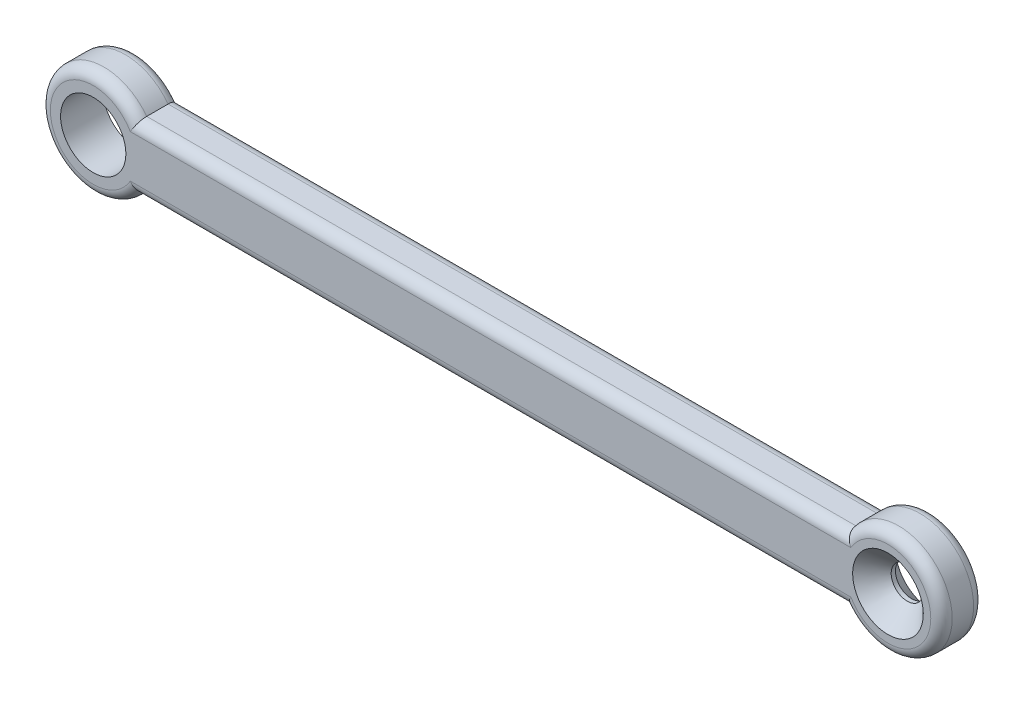
ISO-10303-21;
HEADER;
FILE_DESCRIPTION(('STEP AP214'),'2;1');
FILE_NAME('part.step','',(''),(''),'','','');
FILE_SCHEMA(('AUTOMOTIVE_DESIGN { 1 0 10303 214 1 1 1 1 }'));
ENDSEC;
DATA;
#1=APPLICATION_CONTEXT('core data for automotive mechanical design processes');
#2=APPLICATION_PROTOCOL_DEFINITION('international standard','automotive_design',2000,#1);
#3=PRODUCT_CONTEXT('',#1,'mechanical');
#4=PRODUCT('Part','Part','',(#3));
#5=PRODUCT_RELATED_PRODUCT_CATEGORY('part','',(#4));
#6=PRODUCT_DEFINITION_FORMATION('','',#4);
#7=PRODUCT_DEFINITION_CONTEXT('part definition',#1,'design');
#8=PRODUCT_DEFINITION('design','',#6,#7);
#9=PRODUCT_DEFINITION_SHAPE('','',#8);
#10=(LENGTH_UNIT() NAMED_UNIT(*) SI_UNIT(.MILLI.,.METRE.));
#11=(NAMED_UNIT(*) PLANE_ANGLE_UNIT() SI_UNIT($,.RADIAN.));
#12=(NAMED_UNIT(*) SI_UNIT($,.STERADIAN.) SOLID_ANGLE_UNIT());
#13=UNCERTAINTY_MEASURE_WITH_UNIT(LENGTH_MEASURE(1.E-05),#10,'distance_accuracy_value','');
#14=(GEOMETRIC_REPRESENTATION_CONTEXT(3) GLOBAL_UNCERTAINTY_ASSIGNED_CONTEXT((#13)) GLOBAL_UNIT_ASSIGNED_CONTEXT((#10,
#11,#12)) REPRESENTATION_CONTEXT('',''));
#15=CARTESIAN_POINT('',(0.,0.,0.));
#16=DIRECTION('',(0.,0.,1.));
#17=DIRECTION('',(1.,0.,0.));
#18=AXIS2_PLACEMENT_3D('',#15,#16,#17);
#19=CARTESIAN_POINT('',(-37.125,0.,0.));
#20=DIRECTION('',(0.,0.,-1.));
#21=DIRECTION('',(-1.,0.,0.));
#22=AXIS2_PLACEMENT_3D('',#19,#20,#21);
#23=PLANE('',#22);
#24=DIRECTION('',(1.,0.,0.));
#25=VECTOR('',#24,1.);
#26=CARTESIAN_POINT('',(-37.125,2.,0.));
#27=LINE('',#26,#25);
#28=CARTESIAN_POINT('',(-33.6608983848623,2.,0.));
#29=VERTEX_POINT('',#28);
#30=CARTESIAN_POINT('',(33.6608983848623,2.,0.));
#31=VERTEX_POINT('',#30);
#32=EDGE_CURVE('E46',#29,#31,#27,.T.);
#33=ORIENTED_EDGE('',*,*,#32,.T.);
#34=CARTESIAN_POINT('',(37.125,0.,0.));
#35=DIRECTION('',(0.,0.,-1.));
#36=DIRECTION('',(-1.,0.,0.));
#37=AXIS2_PLACEMENT_3D('',#34,#35,#36);
#38=CIRCLE('',#37,4.);
#39=CARTESIAN_POINT('',(33.6608983848623,-2.,0.));
#40=VERTEX_POINT('',#39);
#41=EDGE_CURVE('E11',#31,#40,#38,.T.);
#42=ORIENTED_EDGE('',*,*,#41,.T.);
#43=DIRECTION('',(-1.,0.,0.));
#44=VECTOR('',#43,1.);
#45=CARTESIAN_POINT('',(-37.125,-2.,0.));
#46=LINE('',#45,#44);
#47=CARTESIAN_POINT('',(-33.6608983848623,-2.,0.));
#48=VERTEX_POINT('',#47);
#49=EDGE_CURVE('E165',#40,#48,#46,.T.);
#50=ORIENTED_EDGE('',*,*,#49,.T.);
#51=CARTESIAN_POINT('',(-37.125,0.,0.));
#52=DIRECTION('',(0.,0.,-1.));
#53=DIRECTION('',(-1.,0.,0.));
#54=AXIS2_PLACEMENT_3D('',#51,#52,#53);
#55=CIRCLE('',#54,4.);
#56=EDGE_CURVE('E163',#48,#29,#55,.T.);
#57=ORIENTED_EDGE('',*,*,#56,.T.);
#58=EDGE_LOOP('',(#33,#42,#50,#57));
#59=FACE_BOUND('',#58,.T.);
#60=CARTESIAN_POINT('',(37.125,0.,0.));
#61=DIRECTION('',(0.,0.,1.));
#62=DIRECTION('',(0.,-1.,0.));
#63=AXIS2_PLACEMENT_3D('',#60,#61,#62);
#64=CIRCLE('',#63,3.3);
#65=CARTESIAN_POINT('',(37.125,-3.3,0.));
#66=VERTEX_POINT('',#65);
#67=EDGE_CURVE('E282',#66,#66,#64,.T.);
#68=ORIENTED_EDGE('',*,*,#67,.T.);
#69=EDGE_LOOP('',(#68));
#70=FACE_BOUND('',#69,.T.);
#71=CARTESIAN_POINT('',(-37.125,0.,0.));
#72=DIRECTION('',(0.,0.,1.));
#73=DIRECTION('',(0.,-1.,0.));
#74=AXIS2_PLACEMENT_3D('',#71,#72,#73);
#75=CIRCLE('',#74,3.04999999999999);
#76=CARTESIAN_POINT('',(-37.125,-3.04999999999999,0.));
#77=VERTEX_POINT('',#76);
#78=EDGE_CURVE('E264',#77,#77,#75,.T.);
#79=ORIENTED_EDGE('',*,*,#78,.T.);
#80=EDGE_LOOP('',(#79));
#81=FACE_BOUND('',#80,.T.);
#82=ADVANCED_FACE('F33',(#59,#70,#81),#23,.T.);
#83=CARTESIAN_POINT('',(-37.125,0.,4.));
#84=DIRECTION('',(0.,0.,-1.));
#85=DIRECTION('',(-1.,0.,0.));
#86=AXIS2_PLACEMENT_3D('',#83,#84,#85);
#87=CYLINDRICAL_SURFACE('',#86,5.);
#88=DIRECTION('',(0.,0.,-1.));
#89=VECTOR('',#88,1.);
#90=CARTESIAN_POINT('',(-33.125,-3.,4.));
#91=LINE('',#90,#89);
#92=CARTESIAN_POINT('',(-33.125,-3.,3.));
#93=VERTEX_POINT('',#92);
#94=CARTESIAN_POINT('',(-33.125,-3.,1.));
#95=VERTEX_POINT('',#94);
#96=EDGE_CURVE('E109',#93,#95,#91,.T.);
#97=ORIENTED_EDGE('',*,*,#96,.F.);
#98=CARTESIAN_POINT('',(-37.125,0.,3.));
#99=DIRECTION('',(0.,0.,-1.));
#100=DIRECTION('',(-1.,0.,0.));
#101=AXIS2_PLACEMENT_3D('',#98,#99,#100);
#102=CIRCLE('',#101,5.);
#103=CARTESIAN_POINT('',(-33.125,3.,3.));
#104=VERTEX_POINT('',#103);
#105=EDGE_CURVE('E125',#93,#104,#102,.T.);
#106=ORIENTED_EDGE('',*,*,#105,.T.);
#107=DIRECTION('',(0.,0.,-1.));
#108=VECTOR('',#107,1.);
#109=CARTESIAN_POINT('',(-33.125,3.,4.));
#110=LINE('',#109,#108);
#111=CARTESIAN_POINT('',(-33.125,3.,1.));
#112=VERTEX_POINT('',#111);
#113=EDGE_CURVE('E259',#104,#112,#110,.T.);
#114=ORIENTED_EDGE('',*,*,#113,.T.);
#115=CARTESIAN_POINT('',(-37.125,0.,1.));
#116=DIRECTION('',(0.,0.,-1.));
#117=DIRECTION('',(-1.,0.,0.));
#118=AXIS2_PLACEMENT_3D('',#115,#116,#117);
#119=CIRCLE('',#118,5.);
#120=EDGE_CURVE('E128',#112,#95,#119,.F.);
#121=ORIENTED_EDGE('',*,*,#120,.T.);
#122=EDGE_LOOP('',(#97,#106,#114,#121));
#123=FACE_BOUND('',#122,.T.);
#124=ADVANCED_FACE('F122',(#123),#87,.T.);
#125=CARTESIAN_POINT('',(-33.125,-3.,4.));
#126=DIRECTION('',(0.,-1.,0.));
#127=DIRECTION('',(0.,0.,-1.));
#128=AXIS2_PLACEMENT_3D('',#125,#126,#127);
#129=PLANE('',#128);
#130=DIRECTION('',(0.,0.,-1.));
#131=VECTOR('',#130,1.);
#132=CARTESIAN_POINT('',(33.125,-3.,4.));
#133=LINE('',#132,#131);
#134=CARTESIAN_POINT('',(33.125,-3.,3.));
#135=VERTEX_POINT('',#134);
#136=CARTESIAN_POINT('',(33.125,-3.,1.));
#137=VERTEX_POINT('',#136);
#138=EDGE_CURVE('E112',#135,#137,#133,.T.);
#139=ORIENTED_EDGE('',*,*,#138,.F.);
#140=DIRECTION('',(-1.,0.,0.));
#141=VECTOR('',#140,1.);
#142=CARTESIAN_POINT('',(-33.125,-3.,3.));
#143=LINE('',#142,#141);
#144=EDGE_CURVE('E106',#135,#93,#143,.T.);
#145=ORIENTED_EDGE('',*,*,#144,.T.);
#146=ORIENTED_EDGE('',*,*,#96,.T.);
#147=DIRECTION('',(-1.,0.,0.));
#148=VECTOR('',#147,1.);
#149=CARTESIAN_POINT('',(-33.125,-3.,1.));
#150=LINE('',#149,#148);
#151=EDGE_CURVE('E118',#95,#137,#150,.F.);
#152=ORIENTED_EDGE('',*,*,#151,.T.);
#153=EDGE_LOOP('',(#139,#145,#146,#152));
#154=FACE_BOUND('',#153,.T.);
#155=ADVANCED_FACE('F108',(#154),#129,.T.);
#156=CARTESIAN_POINT('',(37.125,0.,4.));
#157=DIRECTION('',(0.,0.,-1.));
#158=DIRECTION('',(-1.,0.,0.));
#159=AXIS2_PLACEMENT_3D('',#156,#157,#158);
#160=CYLINDRICAL_SURFACE('',#159,5.);
#161=DIRECTION('',(0.,0.,-1.));
#162=VECTOR('',#161,1.);
#163=CARTESIAN_POINT('',(33.125,3.,4.));
#164=LINE('',#163,#162);
#165=CARTESIAN_POINT('',(33.125,3.,3.));
#166=VERTEX_POINT('',#165);
#167=CARTESIAN_POINT('',(33.125,3.,1.));
#168=VERTEX_POINT('',#167);
#169=EDGE_CURVE('E263',#166,#168,#164,.T.);
#170=ORIENTED_EDGE('',*,*,#169,.F.);
#171=CARTESIAN_POINT('',(37.125,0.,3.));
#172=DIRECTION('',(0.,0.,-1.));
#173=DIRECTION('',(-1.,0.,0.));
#174=AXIS2_PLACEMENT_3D('',#171,#172,#173);
#175=CIRCLE('',#174,5.);
#176=EDGE_CURVE('E161',#166,#135,#175,.T.);
#177=ORIENTED_EDGE('',*,*,#176,.T.);
#178=ORIENTED_EDGE('',*,*,#138,.T.);
#179=CARTESIAN_POINT('',(37.125,0.,1.));
#180=DIRECTION('',(0.,0.,-1.));
#181=DIRECTION('',(-1.,0.,0.));
#182=AXIS2_PLACEMENT_3D('',#179,#180,#181);
#183=CIRCLE('',#182,5.);
#184=EDGE_CURVE('E117',#137,#168,#183,.F.);
#185=ORIENTED_EDGE('',*,*,#184,.T.);
#186=EDGE_LOOP('',(#170,#177,#178,#185));
#187=FACE_BOUND('',#186,.T.);
#188=ADVANCED_FACE('F247',(#187),#160,.T.);
#189=CARTESIAN_POINT('',(-33.125,3.,4.));
#190=DIRECTION('',(0.,1.,0.));
#191=DIRECTION('',(0.,0.,1.));
#192=AXIS2_PLACEMENT_3D('',#189,#190,#191);
#193=PLANE('',#192);
#194=ORIENTED_EDGE('',*,*,#113,.F.);
#195=DIRECTION('',(1.,0.,0.));
#196=VECTOR('',#195,1.);
#197=CARTESIAN_POINT('',(33.125,3.,3.));
#198=LINE('',#197,#196);
#199=EDGE_CURVE('E156',#104,#166,#198,.T.);
#200=ORIENTED_EDGE('',*,*,#199,.T.);
#201=ORIENTED_EDGE('',*,*,#169,.T.);
#202=DIRECTION('',(1.,0.,0.));
#203=VECTOR('',#202,1.);
#204=CARTESIAN_POINT('',(-33.125,3.,1.));
#205=LINE('',#204,#203);
#206=EDGE_CURVE('E154',#168,#112,#205,.F.);
#207=ORIENTED_EDGE('',*,*,#206,.T.);
#208=EDGE_LOOP('',(#194,#200,#201,#207));
#209=FACE_BOUND('',#208,.T.);
#210=ADVANCED_FACE('F250',(#209),#193,.T.);
#211=CARTESIAN_POINT('',(-37.125,0.,4.));
#212=DIRECTION('',(0.,0.,-1.));
#213=DIRECTION('',(-1.,0.,0.));
#214=AXIS2_PLACEMENT_3D('',#211,#212,#213);
#215=PLANE('',#214);
#216=DIRECTION('',(1.,0.,0.));
#217=VECTOR('',#216,1.);
#218=CARTESIAN_POINT('',(-33.125,2.,4.));
#219=LINE('',#218,#217);
#220=CARTESIAN_POINT('',(33.6608983848623,2.,4.));
#221=VERTEX_POINT('',#220);
#222=CARTESIAN_POINT('',(-33.6608983848623,2.,4.));
#223=VERTEX_POINT('',#222);
#224=EDGE_CURVE('E150',#221,#223,#219,.F.);
#225=ORIENTED_EDGE('',*,*,#224,.T.);
#226=CARTESIAN_POINT('',(-37.125,0.,4.));
#227=DIRECTION('',(0.,0.,-1.));
#228=DIRECTION('',(-1.,0.,0.));
#229=AXIS2_PLACEMENT_3D('',#226,#227,#228);
#230=CIRCLE('',#229,4.);
#231=CARTESIAN_POINT('',(-33.6608983848623,-2.,4.));
#232=VERTEX_POINT('',#231);
#233=EDGE_CURVE('E152',#223,#232,#230,.F.);
#234=ORIENTED_EDGE('',*,*,#233,.T.);
#235=DIRECTION('',(-1.,0.,0.));
#236=VECTOR('',#235,1.);
#237=CARTESIAN_POINT('',(33.125,-2.,4.));
#238=LINE('',#237,#236);
#239=CARTESIAN_POINT('',(33.6608983848623,-2.,4.));
#240=VERTEX_POINT('',#239);
#241=EDGE_CURVE('E133',#232,#240,#238,.F.);
#242=ORIENTED_EDGE('',*,*,#241,.T.);
#243=CARTESIAN_POINT('',(37.125,0.,4.));
#244=DIRECTION('',(0.,0.,-1.));
#245=DIRECTION('',(-1.,0.,0.));
#246=AXIS2_PLACEMENT_3D('',#243,#244,#245);
#247=CIRCLE('',#246,4.);
#248=EDGE_CURVE('E143',#240,#221,#247,.F.);
#249=ORIENTED_EDGE('',*,*,#248,.T.);
#250=EDGE_LOOP('',(#225,#234,#242,#249));
#251=FACE_BOUND('',#250,.T.);
#252=CARTESIAN_POINT('',(37.125,0.,4.));
#253=DIRECTION('',(0.,0.,1.));
#254=DIRECTION('',(0.,-1.,0.));
#255=AXIS2_PLACEMENT_3D('',#252,#253,#254);
#256=CIRCLE('',#255,3.3);
#257=CARTESIAN_POINT('',(37.125,-3.3,4.));
#258=VERTEX_POINT('',#257);
#259=EDGE_CURVE('E279',#258,#258,#256,.T.);
#260=ORIENTED_EDGE('',*,*,#259,.F.);
#261=EDGE_LOOP('',(#260));
#262=FACE_BOUND('',#261,.T.);
#263=CARTESIAN_POINT('',(-37.125,0.,4.));
#264=DIRECTION('',(0.,0.,1.));
#265=DIRECTION('',(0.,-1.,0.));
#266=AXIS2_PLACEMENT_3D('',#263,#264,#265);
#267=CIRCLE('',#266,3.04999999999999);
#268=CARTESIAN_POINT('',(-37.125,-3.04999999999999,4.));
#269=VERTEX_POINT('',#268);
#270=EDGE_CURVE('E267',#269,#269,#267,.T.);
#271=ORIENTED_EDGE('',*,*,#270,.F.);
#272=EDGE_LOOP('',(#271));
#273=FACE_BOUND('',#272,.T.);
#274=ADVANCED_FACE('F243',(#251,#262,#273),#215,.F.);
#275=CARTESIAN_POINT('',(-37.125,0.,4.));
#276=DIRECTION('',(0.,0.,1.));
#277=DIRECTION('',(0.,-1.,0.));
#278=AXIS2_PLACEMENT_3D('',#275,#276,#277);
#279=CYLINDRICAL_SURFACE('',#278,3.04999999999999);
#280=ORIENTED_EDGE('',*,*,#78,.F.);
#281=EDGE_LOOP('',(#280));
#282=FACE_BOUND('',#281,.T.);
#283=ORIENTED_EDGE('',*,*,#270,.T.);
#284=EDGE_LOOP('',(#283));
#285=FACE_BOUND('',#284,.T.);
#286=ADVANCED_FACE('F257',(#282,#285),#279,.F.);
#287=CARTESIAN_POINT('',(37.125,0.,1.8));
#288=DIRECTION('',(0.,0.,-1.));
#289=DIRECTION('',(0.,1.,0.));
#290=AXIS2_PLACEMENT_3D('',#287,#288,#289);
#291=CONICAL_SURFACE('',#290,1.5,0.785398163397447);
#292=ORIENTED_EDGE('',*,*,#67,.F.);
#293=EDGE_LOOP('',(#292));
#294=FACE_BOUND('',#293,.T.);
#295=CARTESIAN_POINT('',(37.125,0.,1.8));
#296=DIRECTION('',(0.,0.,1.));
#297=DIRECTION('',(0.,-1.,0.));
#298=AXIS2_PLACEMENT_3D('',#295,#296,#297);
#299=CIRCLE('',#298,1.5);
#300=CARTESIAN_POINT('',(37.125,-1.5,1.8));
#301=VERTEX_POINT('',#300);
#302=EDGE_CURVE('E273',#301,#301,#299,.T.);
#303=ORIENTED_EDGE('',*,*,#302,.T.);
#304=EDGE_LOOP('',(#303));
#305=FACE_BOUND('',#304,.T.);
#306=ADVANCED_FACE('F295',(#294,#305),#291,.F.);
#307=CARTESIAN_POINT('',(37.125,0.,4.));
#308=DIRECTION('',(0.,0.,1.));
#309=DIRECTION('',(0.,-1.,0.));
#310=AXIS2_PLACEMENT_3D('',#307,#308,#309);
#311=CYLINDRICAL_SURFACE('',#310,1.5);
#312=ORIENTED_EDGE('',*,*,#302,.F.);
#313=EDGE_LOOP('',(#312));
#314=FACE_BOUND('',#313,.T.);
#315=CARTESIAN_POINT('',(37.125,0.,2.2));
#316=DIRECTION('',(0.,0.,1.));
#317=DIRECTION('',(0.,-1.,0.));
#318=AXIS2_PLACEMENT_3D('',#315,#316,#317);
#319=CIRCLE('',#318,1.5);
#320=CARTESIAN_POINT('',(37.125,-1.5,2.2));
#321=VERTEX_POINT('',#320);
#322=EDGE_CURVE('E276',#321,#321,#319,.T.);
#323=ORIENTED_EDGE('',*,*,#322,.T.);
#324=EDGE_LOOP('',(#323));
#325=FACE_BOUND('',#324,.T.);
#326=ADVANCED_FACE('F300',(#314,#325),#311,.F.);
#327=CARTESIAN_POINT('',(37.125,0.,4.));
#328=DIRECTION('',(0.,0.,1.));
#329=DIRECTION('',(0.,-1.,0.));
#330=AXIS2_PLACEMENT_3D('',#327,#328,#329);
#331=CONICAL_SURFACE('',#330,3.3,0.785398163397447);
#332=ORIENTED_EDGE('',*,*,#322,.F.);
#333=EDGE_LOOP('',(#332));
#334=FACE_BOUND('',#333,.T.);
#335=ORIENTED_EDGE('',*,*,#259,.T.);
#336=EDGE_LOOP('',(#335));
#337=FACE_BOUND('',#336,.T.);
#338=ADVANCED_FACE('F201',(#334,#337),#331,.F.);
#339=CARTESIAN_POINT('',(37.125,0.,3.));
#340=DIRECTION('',(0.,0.,-1.));
#341=DIRECTION('',(-1.,0.,0.));
#342=AXIS2_PLACEMENT_3D('',#339,#340,#341);
#343=TOROIDAL_SURFACE('',#342,4.,1.);
#344=CARTESIAN_POINT('',(33.125,3.,3.));
#345=CARTESIAN_POINT('',(33.1249997186835,3.00000118487758,3.02593584117217));
#346=CARTESIAN_POINT('',(33.1255048422214,2.99899024971479,3.05185848371749));
#347=CARTESIAN_POINT('',(33.1275174211415,2.99496636522971,3.10350244341266));
#348=CARTESIAN_POINT('',(33.1290246301367,2.99195390803018,3.12922380847896));
#349=CARTESIAN_POINT('',(33.1350201848329,2.97998050347589,3.20562797357342));
#350=CARTESIAN_POINT('',(33.1409826315796,2.96808309336858,3.2557718679136));
#351=CARTESIAN_POINT('',(33.1566200908392,2.93699471408967,3.35306188885311));
#352=CARTESIAN_POINT('',(33.1662933679872,2.91780715418682,3.40020940470925));
#353=CARTESIAN_POINT('',(33.1890294624262,2.87293379421447,3.49043466378816));
#354=CARTESIAN_POINT('',(33.2020940996145,2.84724450532374,3.53351020489424));
#355=CARTESIAN_POINT('',(33.2317833208305,2.78922698317181,3.61625708217515));
#356=CARTESIAN_POINT('',(33.2485261796482,2.756680166667,3.65573197239517));
#357=CARTESIAN_POINT('',(33.2847750962425,2.68674973312791,3.72864880091132));
#358=CARTESIAN_POINT('',(33.3042818722659,2.64936485906855,3.76208916589023));
#359=CARTESIAN_POINT('',(33.3476452828904,2.56697350675941,3.82553326631047));
#360=CARTESIAN_POINT('',(33.371741407605,2.52157888102645,3.85486819768669));
#361=CARTESIAN_POINT('',(33.4221421630572,2.42763014490771,3.90553011803555));
#362=CARTESIAN_POINT('',(33.4484486667458,2.37907336308626,3.92685023024644));
#363=CARTESIAN_POINT('',(33.504466656447,2.27685685167102,3.96253254553221));
#364=CARTESIAN_POINT('',(33.5342883233148,2.2230703241737,3.97635450540737));
#365=CARTESIAN_POINT('',(33.5951463148326,2.11473605902906,3.99491079093398));
#366=CARTESIAN_POINT('',(33.6261801634544,2.06019000592378,3.99966274451616));
#367=CARTESIAN_POINT('',(33.6586334551975,2.00392392816219,3.99999423692863));
#368=CARTESIAN_POINT('',(33.6597657404586,2.00196178986711,4.00000001055694));
#369=CARTESIAN_POINT('',(33.6608983848623,2.,4.));
#370=B_SPLINE_CURVE_WITH_KNOTS('',3,(#344,#345,#346,#347,#348,#349,#350,#351,#352,#353,#354,
#355,#356,#357,#358,#359,#360,#361,#362,#363,#364,#365,#366,#367,#368,#369),.UNSPECIFIED.,.F.,
.F.,(4,2,2,2,2,2,2,2,2,2,2,2,4),(0.,0.0777570801348415,0.155495048875958,0.310316804326361,
0.465066245681997,0.619898902143675,0.7807279340792,0.941598836856935,1.11840921049057,
1.29537094407907,1.48379700692641,1.67185648156941,1.67865268078424),.UNSPECIFIED.);
#371=EDGE_CURVE('E137',#221,#166,#370,.F.);
#372=ORIENTED_EDGE('',*,*,#371,.F.);
#373=ORIENTED_EDGE('',*,*,#248,.F.);
#374=CARTESIAN_POINT('',(33.125,-3.,3.));
#375=CARTESIAN_POINT('',(33.1249997186835,-3.00000118487758,3.02593584117217));
#376=CARTESIAN_POINT('',(33.1255048422214,-2.99899024971479,3.05185848371749));
#377=CARTESIAN_POINT('',(33.1275174211415,-2.99496636522971,3.10350244341266));
#378=CARTESIAN_POINT('',(33.1290246301367,-2.99195390803018,3.12922380847896));
#379=CARTESIAN_POINT('',(33.1350201848329,-2.97998050347589,3.20562797357342));
#380=CARTESIAN_POINT('',(33.1409826315796,-2.96808309336858,3.2557718679136));
#381=CARTESIAN_POINT('',(33.1566200908392,-2.93699471408967,3.35306188885311));
#382=CARTESIAN_POINT('',(33.1662933679872,-2.91780715418682,3.40020940470925));
#383=CARTESIAN_POINT('',(33.1890294624262,-2.87293379421447,3.49043466378816));
#384=CARTESIAN_POINT('',(33.2020940996145,-2.84724450532374,3.53351020489424));
#385=CARTESIAN_POINT('',(33.2317833208305,-2.78922698317181,3.61625708217515));
#386=CARTESIAN_POINT('',(33.2485261796482,-2.756680166667,3.65573197239517));
#387=CARTESIAN_POINT('',(33.2847750962425,-2.68674973312791,3.72864880091132));
#388=CARTESIAN_POINT('',(33.3042818722659,-2.64936485906855,3.76208916589023));
#389=CARTESIAN_POINT('',(33.3476452828904,-2.56697350675941,3.82553326631047));
#390=CARTESIAN_POINT('',(33.371741407605,-2.52157888102645,3.85486819768669));
#391=CARTESIAN_POINT('',(33.4221421630572,-2.42763014490771,3.90553011803555));
#392=CARTESIAN_POINT('',(33.4484486667458,-2.37907336308626,3.92685023024644));
#393=CARTESIAN_POINT('',(33.504466656447,-2.27685685167102,3.96253254553221));
#394=CARTESIAN_POINT('',(33.5342883233148,-2.2230703241737,3.97635450540737));
#395=CARTESIAN_POINT('',(33.5951463148326,-2.11473605902906,3.99491079093398));
#396=CARTESIAN_POINT('',(33.6261801634544,-2.06019000592378,3.99966274451616));
#397=CARTESIAN_POINT('',(33.6586334551975,-2.00392392816219,3.99999423692863));
#398=CARTESIAN_POINT('',(33.6597657404586,-2.00196178986711,4.00000001055694));
#399=CARTESIAN_POINT('',(33.6608983848623,-2.,4.));
#400=B_SPLINE_CURVE_WITH_KNOTS('',3,(#374,#375,#376,#377,#378,#379,#380,#381,#382,#383,#384,
#385,#386,#387,#388,#389,#390,#391,#392,#393,#394,#395,#396,#397,#398,#399),.UNSPECIFIED.,.F.,
.F.,(4,2,2,2,2,2,2,2,2,2,2,2,4),(0.,0.0777570801348416,0.155495048875958,0.310316804326361,
0.465066245681997,0.619898902143675,0.7807279340792,0.941598836856935,1.11840921049057,
1.29537094407907,1.48379700692641,1.67185648156941,1.67865268078424),.UNSPECIFIED.);
#401=EDGE_CURVE('E192',#135,#240,#400,.T.);
#402=ORIENTED_EDGE('',*,*,#401,.F.);
#403=ORIENTED_EDGE('',*,*,#176,.F.);
#404=EDGE_LOOP('',(#372,#373,#402,#403));
#405=FACE_BOUND('',#404,.T.);
#406=ADVANCED_FACE('F197',(#405),#343,.T.);
#407=CARTESIAN_POINT('',(-33.125,-2.,3.));
#408=DIRECTION('',(1.,0.,0.));
#409=DIRECTION('',(0.,0.,-1.));
#410=AXIS2_PLACEMENT_3D('',#407,#408,#409);
#411=CYLINDRICAL_SURFACE('',#410,1.);
#412=ORIENTED_EDGE('',*,*,#401,.T.);
#413=ORIENTED_EDGE('',*,*,#241,.F.);
#414=CARTESIAN_POINT('',(-33.125,-3.,3.));
#415=CARTESIAN_POINT('',(-33.1249997186835,-3.00000118487758,3.02593584117217));
#416=CARTESIAN_POINT('',(-33.1255048422214,-2.99899024971479,3.05185848371749));
#417=CARTESIAN_POINT('',(-33.1275174211415,-2.99496636522971,3.10350244341266));
#418=CARTESIAN_POINT('',(-33.1290246301367,-2.99195390803018,3.12922380847896));
#419=CARTESIAN_POINT('',(-33.1350201848329,-2.97998050347589,3.20562797357342));
#420=CARTESIAN_POINT('',(-33.1409826315796,-2.96808309336858,3.2557718679136));
#421=CARTESIAN_POINT('',(-33.1566200908392,-2.93699471408967,3.35306188885311));
#422=CARTESIAN_POINT('',(-33.1662933679872,-2.91780715418682,3.40020940470925));
#423=CARTESIAN_POINT('',(-33.1890294624262,-2.87293379421447,3.49043466378816));
#424=CARTESIAN_POINT('',(-33.2020940996145,-2.84724450532374,3.53351020489424));
#425=CARTESIAN_POINT('',(-33.2317833208305,-2.78922698317181,3.61625708217515));
#426=CARTESIAN_POINT('',(-33.2485261796482,-2.756680166667,3.65573197239517));
#427=CARTESIAN_POINT('',(-33.2847750962425,-2.68674973312791,3.72864880091132));
#428=CARTESIAN_POINT('',(-33.3042818722659,-2.64936485906855,3.76208916589023));
#429=CARTESIAN_POINT('',(-33.3476452828904,-2.56697350675941,3.82553326631047));
#430=CARTESIAN_POINT('',(-33.371741407605,-2.52157888102645,3.85486819768669));
#431=CARTESIAN_POINT('',(-33.4221421630572,-2.42763014490771,3.90553011803555));
#432=CARTESIAN_POINT('',(-33.4484486667458,-2.37907336308626,3.92685023024644));
#433=CARTESIAN_POINT('',(-33.504466656447,-2.27685685167102,3.96253254553221));
#434=CARTESIAN_POINT('',(-33.5342883233148,-2.2230703241737,3.97635450540737));
#435=CARTESIAN_POINT('',(-33.5951463148326,-2.11473605902906,3.99491079093398));
#436=CARTESIAN_POINT('',(-33.6261801634544,-2.06019000592378,3.99966274451616));
#437=CARTESIAN_POINT('',(-33.6586334551975,-2.00392392816219,3.99999423692863));
#438=CARTESIAN_POINT('',(-33.6597657404586,-2.00196178986711,4.00000001055694));
#439=CARTESIAN_POINT('',(-33.6608983848623,-2.,4.));
#440=B_SPLINE_CURVE_WITH_KNOTS('',3,(#414,#415,#416,#417,#418,#419,#420,#421,#422,#423,#424,
#425,#426,#427,#428,#429,#430,#431,#432,#433,#434,#435,#436,#437,#438,#439),.UNSPECIFIED.,.F.,
.F.,(4,2,2,2,2,2,2,2,2,2,2,2,4),(0.,0.0777570801348416,0.155495048875958,0.310316804326361,
0.465066245681997,0.619898902143675,0.7807279340792,0.941598836856935,1.11840921049057,
1.29537094407907,1.48379700692641,1.67185648156941,1.67865268078424),.UNSPECIFIED.);
#441=EDGE_CURVE('E131',#93,#232,#440,.T.);
#442=ORIENTED_EDGE('',*,*,#441,.F.);
#443=ORIENTED_EDGE('',*,*,#144,.F.);
#444=EDGE_LOOP('',(#412,#413,#442,#443));
#445=FACE_BOUND('',#444,.T.);
#446=ADVANCED_FACE('F132',(#445),#411,.T.);
#447=CARTESIAN_POINT('',(-33.125,2.,3.));
#448=DIRECTION('',(-1.,0.,0.));
#449=DIRECTION('',(0.,0.,1.));
#450=AXIS2_PLACEMENT_3D('',#447,#448,#449);
#451=CYLINDRICAL_SURFACE('',#450,1.);
#452=ORIENTED_EDGE('',*,*,#371,.T.);
#453=ORIENTED_EDGE('',*,*,#199,.F.);
#454=CARTESIAN_POINT('',(-33.125,3.,3.));
#455=CARTESIAN_POINT('',(-33.1249997186835,3.00000118487758,3.02593584117217));
#456=CARTESIAN_POINT('',(-33.1255048422214,2.99899024971479,3.05185848371749));
#457=CARTESIAN_POINT('',(-33.1275174211415,2.99496636522971,3.10350244341266));
#458=CARTESIAN_POINT('',(-33.1290246301367,2.99195390803018,3.12922380847896));
#459=CARTESIAN_POINT('',(-33.1350201848329,2.97998050347589,3.20562797357342));
#460=CARTESIAN_POINT('',(-33.1409826315796,2.96808309336858,3.2557718679136));
#461=CARTESIAN_POINT('',(-33.1566200908392,2.93699471408967,3.35306188885311));
#462=CARTESIAN_POINT('',(-33.1662933679872,2.91780715418682,3.40020940470925));
#463=CARTESIAN_POINT('',(-33.1890294624262,2.87293379421447,3.49043466378816));
#464=CARTESIAN_POINT('',(-33.2020940996145,2.84724450532374,3.53351020489424));
#465=CARTESIAN_POINT('',(-33.2317833208305,2.78922698317181,3.61625708217515));
#466=CARTESIAN_POINT('',(-33.2485261796482,2.756680166667,3.65573197239517));
#467=CARTESIAN_POINT('',(-33.2847750962425,2.68674973312791,3.72864880091132));
#468=CARTESIAN_POINT('',(-33.3042818722659,2.64936485906855,3.76208916589023));
#469=CARTESIAN_POINT('',(-33.3476452828904,2.56697350675941,3.82553326631047));
#470=CARTESIAN_POINT('',(-33.371741407605,2.52157888102645,3.85486819768669));
#471=CARTESIAN_POINT('',(-33.4221421630572,2.42763014490771,3.90553011803555));
#472=CARTESIAN_POINT('',(-33.4484486667458,2.37907336308626,3.92685023024644));
#473=CARTESIAN_POINT('',(-33.504466656447,2.27685685167102,3.96253254553221));
#474=CARTESIAN_POINT('',(-33.5342883233148,2.2230703241737,3.97635450540737));
#475=CARTESIAN_POINT('',(-33.5951463148326,2.11473605902906,3.99491079093398));
#476=CARTESIAN_POINT('',(-33.6261801634544,2.06019000592378,3.99966274451616));
#477=CARTESIAN_POINT('',(-33.6586334551975,2.00392392816219,3.99999423692863));
#478=CARTESIAN_POINT('',(-33.6597657404586,2.00196178986711,4.00000001055694));
#479=CARTESIAN_POINT('',(-33.6608983848623,2.,4.));
#480=B_SPLINE_CURVE_WITH_KNOTS('',3,(#454,#455,#456,#457,#458,#459,#460,#461,#462,#463,#464,
#465,#466,#467,#468,#469,#470,#471,#472,#473,#474,#475,#476,#477,#478,#479),.UNSPECIFIED.,.F.,
.F.,(4,2,2,2,2,2,2,2,2,2,2,2,4),(0.,0.0777570801348416,0.155495048875958,0.310316804326361,
0.465066245681997,0.619898902143675,0.7807279340792,0.941598836856935,1.11840921049057,
1.29537094407907,1.48379700692641,1.67185648156941,1.67865268078424),.UNSPECIFIED.);
#481=EDGE_CURVE('E138',#223,#104,#480,.F.);
#482=ORIENTED_EDGE('',*,*,#481,.F.);
#483=ORIENTED_EDGE('',*,*,#224,.F.);
#484=EDGE_LOOP('',(#452,#453,#482,#483));
#485=FACE_BOUND('',#484,.T.);
#486=ADVANCED_FACE('F180',(#485),#451,.T.);
#487=CARTESIAN_POINT('',(-37.125,0.,3.));
#488=DIRECTION('',(0.,0.,-1.));
#489=DIRECTION('',(-1.,0.,0.));
#490=AXIS2_PLACEMENT_3D('',#487,#488,#489);
#491=TOROIDAL_SURFACE('',#490,4.,1.);
#492=ORIENTED_EDGE('',*,*,#441,.T.);
#493=ORIENTED_EDGE('',*,*,#233,.F.);
#494=ORIENTED_EDGE('',*,*,#481,.T.);
#495=ORIENTED_EDGE('',*,*,#105,.F.);
#496=EDGE_LOOP('',(#492,#493,#494,#495));
#497=FACE_BOUND('',#496,.T.);
#498=ADVANCED_FACE('F140',(#497),#491,.T.);
#499=CARTESIAN_POINT('',(-37.125,0.,1.));
#500=DIRECTION('',(0.,0.,-1.));
#501=DIRECTION('',(-1.,0.,0.));
#502=AXIS2_PLACEMENT_3D('',#499,#500,#501);
#503=TOROIDAL_SURFACE('',#502,4.,1.);
#504=CARTESIAN_POINT('',(-33.125,-3.,1.));
#505=CARTESIAN_POINT('',(-33.1249997186835,-3.00000118487758,0.97406415882783));
#506=CARTESIAN_POINT('',(-33.1255048422214,-2.99899024971479,0.948141516282508));
#507=CARTESIAN_POINT('',(-33.1275174211415,-2.99496636522971,0.896497556587339));
#508=CARTESIAN_POINT('',(-33.1290246301367,-2.99195390803018,0.87077619152104));
#509=CARTESIAN_POINT('',(-33.1350201848329,-2.97998050347589,0.794372026426581));
#510=CARTESIAN_POINT('',(-33.1409826315796,-2.96808309336858,0.744228132086403));
#511=CARTESIAN_POINT('',(-33.1566200908392,-2.93699471408967,0.64693811114689));
#512=CARTESIAN_POINT('',(-33.1662933679872,-2.91780715418682,0.599790595290747));
#513=CARTESIAN_POINT('',(-33.1890294624262,-2.87293379421447,0.509565336211842));
#514=CARTESIAN_POINT('',(-33.2020940996145,-2.84724450532374,0.466489795105761));
#515=CARTESIAN_POINT('',(-33.2317833208305,-2.78922698317181,0.383742917824848));
#516=CARTESIAN_POINT('',(-33.2485261796482,-2.756680166667,0.344268027604829));
#517=CARTESIAN_POINT('',(-33.2847750962425,-2.68674973312791,0.271351199088675));
#518=CARTESIAN_POINT('',(-33.3042818722659,-2.64936485906856,0.237910834109768));
#519=CARTESIAN_POINT('',(-33.3476452828904,-2.56697350675941,0.174466733689526));
#520=CARTESIAN_POINT('',(-33.371741407605,-2.52157888102645,0.145131802313309));
#521=CARTESIAN_POINT('',(-33.4221421630572,-2.42763014490771,0.0944698819644547));
#522=CARTESIAN_POINT('',(-33.4484486667458,-2.37907336308626,0.0731497697535615));
#523=CARTESIAN_POINT('',(-33.504466656447,-2.27685685167102,0.0374674544677941));
#524=CARTESIAN_POINT('',(-33.5342883233148,-2.22307032417369,0.0236454945926268));
#525=CARTESIAN_POINT('',(-33.5951463148327,-2.11473605902907,0.00508920906601517));
#526=CARTESIAN_POINT('',(-33.6261801634545,-2.06019000592383,0.000337255483837509));
#527=CARTESIAN_POINT('',(-33.6586334551975,-2.0039239281622,5.76307137259844E-06));
#528=CARTESIAN_POINT('',(-33.6597657404586,-2.00196178986712,-1.05569419775694E-08));
#529=CARTESIAN_POINT('',(-33.6608983848623,-2.,0.));
#530=B_SPLINE_CURVE_WITH_KNOTS('',3,(#504,#505,#506,#507,#508,#509,#510,#511,#512,#513,#514,
#515,#516,#517,#518,#519,#520,#521,#522,#523,#524,#525,#526,#527,#528,#529),.UNSPECIFIED.,.F.,
.F.,(4,2,2,2,2,2,2,2,2,2,2,2,4),(0.,0.0777570801348412,0.155495048875958,0.310316804326361,
0.465066245681997,0.619898902143676,0.780727934079201,0.941598836856935,1.11840921049057,
1.29537094407907,1.48379700692641,1.6718564815694,1.67865268078424),.UNSPECIFIED.);
#531=EDGE_CURVE('E217',#95,#48,#530,.T.);
#532=ORIENTED_EDGE('',*,*,#531,.F.);
#533=ORIENTED_EDGE('',*,*,#120,.F.);
#534=CARTESIAN_POINT('',(-33.125,3.,1.));
#535=CARTESIAN_POINT('',(-33.1249997186835,3.00000118487758,0.97406415882783));
#536=CARTESIAN_POINT('',(-33.1255048422214,2.99899024971479,0.948141516282508));
#537=CARTESIAN_POINT('',(-33.1275174211415,2.99496636522971,0.896497556587339));
#538=CARTESIAN_POINT('',(-33.1290246301367,2.99195390803018,0.87077619152104));
#539=CARTESIAN_POINT('',(-33.1350201848329,2.97998050347589,0.794372026426581));
#540=CARTESIAN_POINT('',(-33.1409826315796,2.96808309336858,0.744228132086403));
#541=CARTESIAN_POINT('',(-33.1566200908392,2.93699471408967,0.64693811114689));
#542=CARTESIAN_POINT('',(-33.1662933679872,2.91780715418682,0.599790595290747));
#543=CARTESIAN_POINT('',(-33.1890294624262,2.87293379421447,0.509565336211842));
#544=CARTESIAN_POINT('',(-33.2020940996145,2.84724450532374,0.466489795105761));
#545=CARTESIAN_POINT('',(-33.2317833208305,2.78922698317181,0.383742917824848));
#546=CARTESIAN_POINT('',(-33.2485261796482,2.756680166667,0.344268027604829));
#547=CARTESIAN_POINT('',(-33.2847750962425,2.68674973312791,0.271351199088675));
#548=CARTESIAN_POINT('',(-33.3042818722659,2.64936485906856,0.237910834109768));
#549=CARTESIAN_POINT('',(-33.3476452828904,2.56697350675941,0.174466733689526));
#550=CARTESIAN_POINT('',(-33.371741407605,2.52157888102645,0.145131802313309));
#551=CARTESIAN_POINT('',(-33.4221421630572,2.42763014490771,0.0944698819644547));
#552=CARTESIAN_POINT('',(-33.4484486667458,2.37907336308626,0.0731497697535615));
#553=CARTESIAN_POINT('',(-33.504466656447,2.27685685167102,0.0374674544677941));
#554=CARTESIAN_POINT('',(-33.5342883233148,2.22307032417369,0.0236454945926268));
#555=CARTESIAN_POINT('',(-33.5951463148327,2.11473605902907,0.00508920906601517));
#556=CARTESIAN_POINT('',(-33.6261801634545,2.06019000592383,0.000337255483837509));
#557=CARTESIAN_POINT('',(-33.6586334551975,2.0039239281622,5.76307137259844E-06));
#558=CARTESIAN_POINT('',(-33.6597657404586,2.00196178986712,-1.05569419775694E-08));
#559=CARTESIAN_POINT('',(-33.6608983848623,2.,0.));
#560=B_SPLINE_CURVE_WITH_KNOTS('',3,(#534,#535,#536,#537,#538,#539,#540,#541,#542,#543,#544,
#545,#546,#547,#548,#549,#550,#551,#552,#553,#554,#555,#556,#557,#558,#559),.UNSPECIFIED.,.F.,
.F.,(4,2,2,2,2,2,2,2,2,2,2,2,4),(0.,0.0777570801348412,0.155495048875958,0.310316804326361,
0.465066245681997,0.619898902143676,0.780727934079201,0.941598836856935,1.11840921049057,
1.29537094407907,1.48379700692641,1.6718564815694,1.67865268078424),.UNSPECIFIED.);
#561=EDGE_CURVE('E38',#29,#112,#560,.F.);
#562=ORIENTED_EDGE('',*,*,#561,.F.);
#563=ORIENTED_EDGE('',*,*,#56,.F.);
#564=EDGE_LOOP('',(#532,#533,#562,#563));
#565=FACE_BOUND('',#564,.T.);
#566=ADVANCED_FACE('F35',(#565),#503,.T.);
#567=CARTESIAN_POINT('',(-37.125,2.,1.));
#568=DIRECTION('',(1.,0.,0.));
#569=DIRECTION('',(0.,0.,-1.));
#570=AXIS2_PLACEMENT_3D('',#567,#568,#569);
#571=CYLINDRICAL_SURFACE('',#570,1.);
#572=ORIENTED_EDGE('',*,*,#561,.T.);
#573=ORIENTED_EDGE('',*,*,#206,.F.);
#574=CARTESIAN_POINT('',(33.125,3.,1.));
#575=CARTESIAN_POINT('',(33.1249997186835,3.00000118487758,0.97406415882783));
#576=CARTESIAN_POINT('',(33.1255048422214,2.99899024971479,0.948141516282508));
#577=CARTESIAN_POINT('',(33.1275174211415,2.99496636522971,0.896497556587339));
#578=CARTESIAN_POINT('',(33.1290246301367,2.99195390803018,0.87077619152104));
#579=CARTESIAN_POINT('',(33.1350201848329,2.97998050347589,0.794372026426581));
#580=CARTESIAN_POINT('',(33.1409826315796,2.96808309336858,0.744228132086403));
#581=CARTESIAN_POINT('',(33.1566200908392,2.93699471408967,0.64693811114689));
#582=CARTESIAN_POINT('',(33.1662933679872,2.91780715418682,0.599790595290747));
#583=CARTESIAN_POINT('',(33.1890294624262,2.87293379421447,0.509565336211842));
#584=CARTESIAN_POINT('',(33.2020940996145,2.84724450532374,0.466489795105761));
#585=CARTESIAN_POINT('',(33.2317833208305,2.78922698317181,0.383742917824849));
#586=CARTESIAN_POINT('',(33.2485261796482,2.756680166667,0.344268027604829));
#587=CARTESIAN_POINT('',(33.2847750962425,2.68674973312791,0.271351199088675));
#588=CARTESIAN_POINT('',(33.3042818722659,2.64936485906855,0.237910834109767));
#589=CARTESIAN_POINT('',(33.3476452828904,2.56697350675941,0.174466733689526));
#590=CARTESIAN_POINT('',(33.371741407605,2.52157888102645,0.145131802313309));
#591=CARTESIAN_POINT('',(33.4221421630572,2.42763014490771,0.0944698819644548));
#592=CARTESIAN_POINT('',(33.4484486667458,2.37907336308626,0.0731497697535617));
#593=CARTESIAN_POINT('',(33.504466656447,2.27685685167102,0.0374674544677945));
#594=CARTESIAN_POINT('',(33.5342883233148,2.22307032417369,0.0236454945926273));
#595=CARTESIAN_POINT('',(33.5951463148327,2.11473605902907,0.00508920906601546));
#596=CARTESIAN_POINT('',(33.6261801634545,2.06019000592383,0.000337255483837773));
#597=CARTESIAN_POINT('',(33.6586334551975,2.0039239281622,5.76307137261722E-06));
#598=CARTESIAN_POINT('',(33.6597657404586,2.00196178986712,-1.05569419676451E-08));
#599=CARTESIAN_POINT('',(33.6608983848623,2.,0.));
#600=B_SPLINE_CURVE_WITH_KNOTS('',3,(#574,#575,#576,#577,#578,#579,#580,#581,#582,#583,#584,
#585,#586,#587,#588,#589,#590,#591,#592,#593,#594,#595,#596,#597,#598,#599),.UNSPECIFIED.,.F.,
.F.,(4,2,2,2,2,2,2,2,2,2,2,2,4),(0.,0.0777570801348414,0.155495048875958,0.310316804326361,
0.465066245681997,0.619898902143675,0.780727934079201,0.941598836856936,1.11840921049057,
1.29537094407907,1.48379700692641,1.6718564815694,1.67865268078424),.UNSPECIFIED.);
#601=EDGE_CURVE('E222',#31,#168,#600,.F.);
#602=ORIENTED_EDGE('',*,*,#601,.F.);
#603=ORIENTED_EDGE('',*,*,#32,.F.);
#604=EDGE_LOOP('',(#572,#573,#602,#603));
#605=FACE_BOUND('',#604,.T.);
#606=ADVANCED_FACE('F209',(#605),#571,.T.);
#607=CARTESIAN_POINT('',(-37.125,-2.,1.));
#608=DIRECTION('',(-1.,0.,0.));
#609=DIRECTION('',(0.,0.,1.));
#610=AXIS2_PLACEMENT_3D('',#607,#608,#609);
#611=CYLINDRICAL_SURFACE('',#610,1.);
#612=ORIENTED_EDGE('',*,*,#531,.T.);
#613=ORIENTED_EDGE('',*,*,#49,.F.);
#614=CARTESIAN_POINT('',(33.125,-3.,1.));
#615=CARTESIAN_POINT('',(33.1249997186835,-3.00000118487758,0.97406415882783));
#616=CARTESIAN_POINT('',(33.1255048422214,-2.99899024971479,0.948141516282508));
#617=CARTESIAN_POINT('',(33.1275174211415,-2.99496636522971,0.896497556587339));
#618=CARTESIAN_POINT('',(33.1290246301367,-2.99195390803018,0.87077619152104));
#619=CARTESIAN_POINT('',(33.1350201848329,-2.97998050347589,0.794372026426581));
#620=CARTESIAN_POINT('',(33.1409826315796,-2.96808309336858,0.744228132086403));
#621=CARTESIAN_POINT('',(33.1566200908392,-2.93699471408967,0.64693811114689));
#622=CARTESIAN_POINT('',(33.1662933679872,-2.91780715418682,0.599790595290747));
#623=CARTESIAN_POINT('',(33.1890294624262,-2.87293379421447,0.509565336211842));
#624=CARTESIAN_POINT('',(33.2020940996145,-2.84724450532374,0.466489795105761));
#625=CARTESIAN_POINT('',(33.2317833208305,-2.78922698317181,0.383742917824848));
#626=CARTESIAN_POINT('',(33.2485261796482,-2.756680166667,0.344268027604829));
#627=CARTESIAN_POINT('',(33.2847750962425,-2.68674973312791,0.271351199088675));
#628=CARTESIAN_POINT('',(33.3042818722659,-2.64936485906856,0.237910834109768));
#629=CARTESIAN_POINT('',(33.3476452828904,-2.56697350675941,0.174466733689526));
#630=CARTESIAN_POINT('',(33.371741407605,-2.52157888102645,0.145131802313309));
#631=CARTESIAN_POINT('',(33.4221421630572,-2.42763014490771,0.0944698819644547));
#632=CARTESIAN_POINT('',(33.4484486667458,-2.37907336308626,0.0731497697535615));
#633=CARTESIAN_POINT('',(33.504466656447,-2.27685685167102,0.0374674544677941));
#634=CARTESIAN_POINT('',(33.5342883233148,-2.22307032417369,0.0236454945926268));
#635=CARTESIAN_POINT('',(33.5951463148327,-2.11473605902907,0.00508920906601517));
#636=CARTESIAN_POINT('',(33.6261801634545,-2.06019000592383,0.000337255483837509));
#637=CARTESIAN_POINT('',(33.6586334551975,-2.0039239281622,5.76307137259844E-06));
#638=CARTESIAN_POINT('',(33.6597657404586,-2.00196178986712,-1.05569419775694E-08));
#639=CARTESIAN_POINT('',(33.6608983848623,-2.,0.));
#640=B_SPLINE_CURVE_WITH_KNOTS('',3,(#614,#615,#616,#617,#618,#619,#620,#621,#622,#623,#624,
#625,#626,#627,#628,#629,#630,#631,#632,#633,#634,#635,#636,#637,#638,#639),.UNSPECIFIED.,.F.,
.F.,(4,2,2,2,2,2,2,2,2,2,2,2,4),(0.,0.0777570801348412,0.155495048875958,0.310316804326361,
0.465066245681997,0.619898902143676,0.780727934079201,0.941598836856935,1.11840921049057,
1.29537094407907,1.48379700692641,1.6718564815694,1.67865268078424),.UNSPECIFIED.);
#641=EDGE_CURVE('E60',#137,#40,#640,.T.);
#642=ORIENTED_EDGE('',*,*,#641,.F.);
#643=ORIENTED_EDGE('',*,*,#151,.F.);
#644=EDGE_LOOP('',(#612,#613,#642,#643));
#645=FACE_BOUND('',#644,.T.);
#646=ADVANCED_FACE('F203',(#645),#611,.T.);
#647=CARTESIAN_POINT('',(37.125,0.,1.));
#648=DIRECTION('',(0.,0.,-1.));
#649=DIRECTION('',(-1.,0.,0.));
#650=AXIS2_PLACEMENT_3D('',#647,#648,#649);
#651=TOROIDAL_SURFACE('',#650,4.,1.);
#652=ORIENTED_EDGE('',*,*,#601,.T.);
#653=ORIENTED_EDGE('',*,*,#184,.F.);
#654=ORIENTED_EDGE('',*,*,#641,.T.);
#655=ORIENTED_EDGE('',*,*,#41,.F.);
#656=EDGE_LOOP('',(#652,#653,#654,#655));
#657=FACE_BOUND('',#656,.T.);
#658=ADVANCED_FACE('F208',(#657),#651,.T.);
#659=CLOSED_SHELL('',(#82,#124,#155,#188,#210,#274,#286,#306,#326,#338,#406,#446,#486,#498,#566,
#606,#646,#658));
#660=MANIFOLD_SOLID_BREP('B2',#659);
#661=ADVANCED_BREP_SHAPE_REPRESENTATION('',(#18,#660),#14);
#662=SHAPE_DEFINITION_REPRESENTATION(#9,#661);
ENDSEC;
END-ISO-10303-21;
